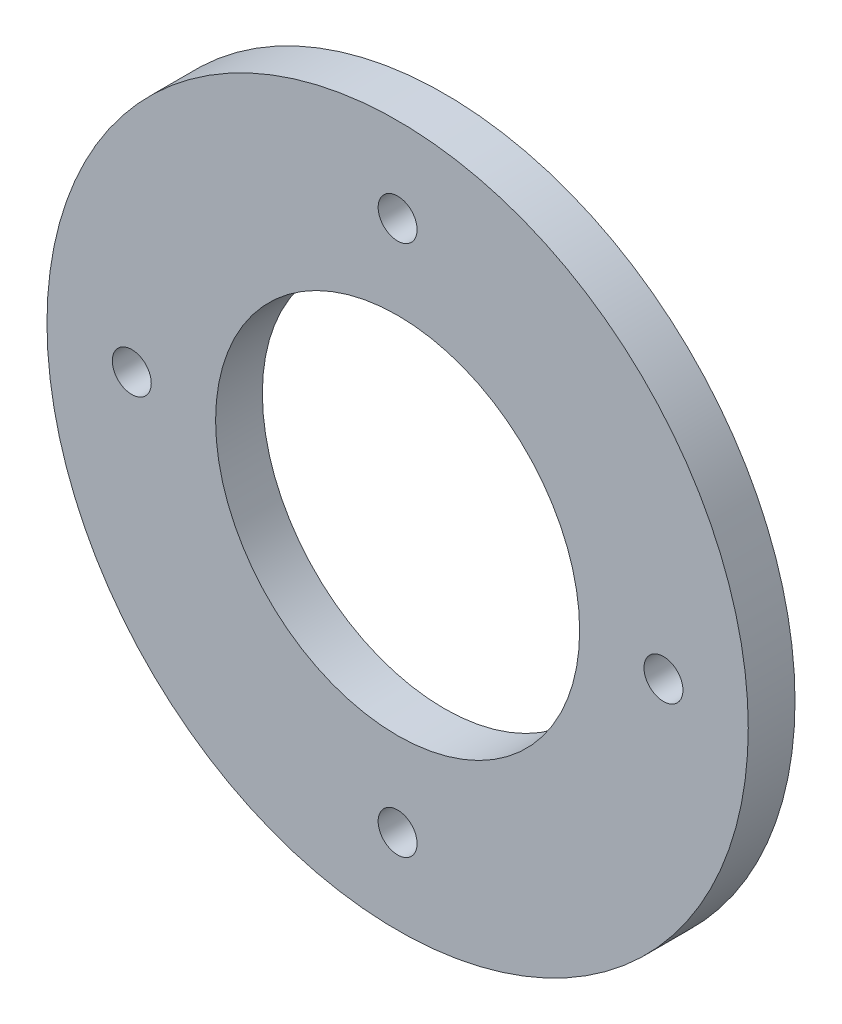
ISO-10303-21;
HEADER;
FILE_DESCRIPTION(('STEP AP214'),'2;1');
FILE_NAME('part.step','',(''),(''),'','','');
FILE_SCHEMA(('AUTOMOTIVE_DESIGN { 1 0 10303 214 1 1 1 1 }'));
ENDSEC;
DATA;
#1=APPLICATION_CONTEXT('core data for automotive mechanical design processes');
#2=APPLICATION_PROTOCOL_DEFINITION('international standard','automotive_design',2000,#1);
#3=PRODUCT_CONTEXT('',#1,'mechanical');
#4=PRODUCT('Part','Part','',(#3));
#5=PRODUCT_RELATED_PRODUCT_CATEGORY('part','',(#4));
#6=PRODUCT_DEFINITION_FORMATION('','',#4);
#7=PRODUCT_DEFINITION_CONTEXT('part definition',#1,'design');
#8=PRODUCT_DEFINITION('design','',#6,#7);
#9=PRODUCT_DEFINITION_SHAPE('','',#8);
#10=(LENGTH_UNIT() NAMED_UNIT(*) SI_UNIT(.MILLI.,.METRE.));
#11=(NAMED_UNIT(*) PLANE_ANGLE_UNIT() SI_UNIT($,.RADIAN.));
#12=(NAMED_UNIT(*) SI_UNIT($,.STERADIAN.) SOLID_ANGLE_UNIT());
#13=UNCERTAINTY_MEASURE_WITH_UNIT(LENGTH_MEASURE(1.E-05),#10,'distance_accuracy_value','');
#14=(GEOMETRIC_REPRESENTATION_CONTEXT(3) GLOBAL_UNCERTAINTY_ASSIGNED_CONTEXT((#13)) GLOBAL_UNIT_ASSIGNED_CONTEXT((#10,
#11,#12)) REPRESENTATION_CONTEXT('',''));
#15=CARTESIAN_POINT('',(0.,0.,0.));
#16=DIRECTION('',(0.,0.,1.));
#17=DIRECTION('',(1.,0.,0.));
#18=AXIS2_PLACEMENT_3D('',#15,#16,#17);
#19=CARTESIAN_POINT('',(0.,0.,3.));
#20=DIRECTION('',(0.,0.,1.));
#21=DIRECTION('',(1.,0.,0.));
#22=AXIS2_PLACEMENT_3D('',#19,#20,#21);
#23=PLANE('',#22);
#24=CARTESIAN_POINT('',(17.0577730501394,0.,3.));
#25=DIRECTION('',(0.,0.,1.));
#26=DIRECTION('',(1.,0.,0.));
#27=AXIS2_PLACEMENT_3D('',#24,#25,#26);
#28=CIRCLE('',#27,1.25);
#29=CARTESIAN_POINT('',(18.3077730501394,0.,3.));
#30=VERTEX_POINT('',#29);
#31=EDGE_CURVE('E78',#30,#30,#28,.T.);
#32=ORIENTED_EDGE('',*,*,#31,.F.);
#33=EDGE_LOOP('',(#32));
#34=FACE_BOUND('',#33,.T.);
#35=CARTESIAN_POINT('',(-17.0577730501394,0.,3.));
#36=DIRECTION('',(0.,0.,1.));
#37=DIRECTION('',(1.,0.,0.));
#38=AXIS2_PLACEMENT_3D('',#35,#36,#37);
#39=CIRCLE('',#38,1.25);
#40=CARTESIAN_POINT('',(-15.8077730501394,0.,3.));
#41=VERTEX_POINT('',#40);
#42=EDGE_CURVE('E62',#41,#41,#39,.T.);
#43=ORIENTED_EDGE('',*,*,#42,.F.);
#44=EDGE_LOOP('',(#43));
#45=FACE_BOUND('',#44,.T.);
#46=CARTESIAN_POINT('',(0.,0.,3.));
#47=DIRECTION('',(0.,0.,1.));
#48=DIRECTION('',(1.,0.,0.));
#49=AXIS2_PLACEMENT_3D('',#46,#47,#48);
#50=CIRCLE('',#49,22.5);
#51=CARTESIAN_POINT('',(22.5,0.,3.));
#52=VERTEX_POINT('',#51);
#53=EDGE_CURVE('E10',#52,#52,#50,.T.);
#54=ORIENTED_EDGE('',*,*,#53,.T.);
#55=EDGE_LOOP('',(#54));
#56=FACE_BOUND('',#55,.T.);
#57=CARTESIAN_POINT('',(0.,0.,3.));
#58=DIRECTION('',(0.,0.,1.));
#59=DIRECTION('',(1.,0.,0.));
#60=AXIS2_PLACEMENT_3D('',#57,#58,#59);
#61=CIRCLE('',#60,11.68);
#62=CARTESIAN_POINT('',(11.68,0.,3.));
#63=VERTEX_POINT('',#62);
#64=EDGE_CURVE('E56',#63,#63,#61,.T.);
#65=ORIENTED_EDGE('',*,*,#64,.F.);
#66=EDGE_LOOP('',(#65));
#67=FACE_BOUND('',#66,.T.);
#68=CARTESIAN_POINT('',(0.,17.0577730501394,3.));
#69=DIRECTION('',(0.,0.,1.));
#70=DIRECTION('',(1.,0.,0.));
#71=AXIS2_PLACEMENT_3D('',#68,#69,#70);
#72=CIRCLE('',#71,1.25);
#73=CARTESIAN_POINT('',(1.25,17.0577730501394,3.));
#74=VERTEX_POINT('',#73);
#75=EDGE_CURVE('E70',#74,#74,#72,.T.);
#76=ORIENTED_EDGE('',*,*,#75,.F.);
#77=EDGE_LOOP('',(#76));
#78=FACE_BOUND('',#77,.T.);
#79=CARTESIAN_POINT('',(0.,-17.0577730501394,3.));
#80=DIRECTION('',(0.,0.,1.));
#81=DIRECTION('',(1.,0.,0.));
#82=AXIS2_PLACEMENT_3D('',#79,#80,#81);
#83=CIRCLE('',#82,1.25);
#84=CARTESIAN_POINT('',(1.25,-17.0577730501394,3.));
#85=VERTEX_POINT('',#84);
#86=EDGE_CURVE('E86',#85,#85,#83,.T.);
#87=ORIENTED_EDGE('',*,*,#86,.F.);
#88=EDGE_LOOP('',(#87));
#89=FACE_BOUND('',#88,.T.);
#90=ADVANCED_FACE('F43',(#34,#45,#56,#67,#78,#89),#23,.T.);
#91=CARTESIAN_POINT('',(0.,0.,0.));
#92=DIRECTION('',(0.,0.,1.));
#93=DIRECTION('',(1.,0.,0.));
#94=AXIS2_PLACEMENT_3D('',#91,#92,#93);
#95=PLANE('',#94);
#96=CARTESIAN_POINT('',(0.,0.,0.));
#97=DIRECTION('',(0.,0.,1.));
#98=DIRECTION('',(1.,0.,0.));
#99=AXIS2_PLACEMENT_3D('',#96,#97,#98);
#100=CIRCLE('',#99,22.5);
#101=CARTESIAN_POINT('',(22.5,0.,0.));
#102=VERTEX_POINT('',#101);
#103=EDGE_CURVE('E47',#102,#102,#100,.T.);
#104=ORIENTED_EDGE('',*,*,#103,.F.);
#105=EDGE_LOOP('',(#104));
#106=FACE_BOUND('',#105,.T.);
#107=CARTESIAN_POINT('',(0.,0.,0.));
#108=DIRECTION('',(0.,0.,1.));
#109=DIRECTION('',(1.,0.,0.));
#110=AXIS2_PLACEMENT_3D('',#107,#108,#109);
#111=CIRCLE('',#110,11.68);
#112=CARTESIAN_POINT('',(11.68,0.,0.));
#113=VERTEX_POINT('',#112);
#114=EDGE_CURVE('E58',#113,#113,#111,.T.);
#115=ORIENTED_EDGE('',*,*,#114,.T.);
#116=EDGE_LOOP('',(#115));
#117=FACE_BOUND('',#116,.T.);
#118=CARTESIAN_POINT('',(-17.0577730501394,0.,0.));
#119=DIRECTION('',(0.,0.,1.));
#120=DIRECTION('',(1.,0.,0.));
#121=AXIS2_PLACEMENT_3D('',#118,#119,#120);
#122=CIRCLE('',#121,1.25);
#123=CARTESIAN_POINT('',(-15.8077730501394,0.,0.));
#124=VERTEX_POINT('',#123);
#125=EDGE_CURVE('E66',#124,#124,#122,.T.);
#126=ORIENTED_EDGE('',*,*,#125,.T.);
#127=EDGE_LOOP('',(#126));
#128=FACE_BOUND('',#127,.T.);
#129=CARTESIAN_POINT('',(0.,17.0577730501394,0.));
#130=DIRECTION('',(0.,0.,1.));
#131=DIRECTION('',(1.,0.,0.));
#132=AXIS2_PLACEMENT_3D('',#129,#130,#131);
#133=CIRCLE('',#132,1.25);
#134=CARTESIAN_POINT('',(1.25,17.0577730501394,0.));
#135=VERTEX_POINT('',#134);
#136=EDGE_CURVE('E74',#135,#135,#133,.T.);
#137=ORIENTED_EDGE('',*,*,#136,.T.);
#138=EDGE_LOOP('',(#137));
#139=FACE_BOUND('',#138,.T.);
#140=CARTESIAN_POINT('',(17.0577730501394,0.,0.));
#141=DIRECTION('',(0.,0.,1.));
#142=DIRECTION('',(1.,0.,0.));
#143=AXIS2_PLACEMENT_3D('',#140,#141,#142);
#144=CIRCLE('',#143,1.25);
#145=CARTESIAN_POINT('',(18.3077730501394,0.,0.));
#146=VERTEX_POINT('',#145);
#147=EDGE_CURVE('E82',#146,#146,#144,.T.);
#148=ORIENTED_EDGE('',*,*,#147,.T.);
#149=EDGE_LOOP('',(#148));
#150=FACE_BOUND('',#149,.T.);
#151=CARTESIAN_POINT('',(0.,-17.0577730501394,0.));
#152=DIRECTION('',(0.,0.,1.));
#153=DIRECTION('',(1.,0.,0.));
#154=AXIS2_PLACEMENT_3D('',#151,#152,#153);
#155=CIRCLE('',#154,1.25);
#156=CARTESIAN_POINT('',(1.25,-17.0577730501394,0.));
#157=VERTEX_POINT('',#156);
#158=EDGE_CURVE('E90',#157,#157,#155,.T.);
#159=ORIENTED_EDGE('',*,*,#158,.T.);
#160=EDGE_LOOP('',(#159));
#161=FACE_BOUND('',#160,.T.);
#162=ADVANCED_FACE('F102',(#106,#117,#128,#139,#150,#161),#95,.F.);
#163=CARTESIAN_POINT('',(0.,0.,3.));
#164=DIRECTION('',(0.,0.,-1.));
#165=DIRECTION('',(-1.,0.,0.));
#166=AXIS2_PLACEMENT_3D('',#163,#164,#165);
#167=CYLINDRICAL_SURFACE('',#166,22.5);
#168=ORIENTED_EDGE('',*,*,#53,.F.);
#169=EDGE_LOOP('',(#168));
#170=FACE_BOUND('',#169,.T.);
#171=ORIENTED_EDGE('',*,*,#103,.T.);
#172=EDGE_LOOP('',(#171));
#173=FACE_BOUND('',#172,.T.);
#174=ADVANCED_FACE('F45',(#170,#173),#167,.T.);
#175=CARTESIAN_POINT('',(0.,0.,3.));
#176=DIRECTION('',(0.,0.,-1.));
#177=DIRECTION('',(-1.,0.,0.));
#178=AXIS2_PLACEMENT_3D('',#175,#176,#177);
#179=CYLINDRICAL_SURFACE('',#178,11.68);
#180=ORIENTED_EDGE('',*,*,#64,.T.);
#181=EDGE_LOOP('',(#180));
#182=FACE_BOUND('',#181,.T.);
#183=ORIENTED_EDGE('',*,*,#114,.F.);
#184=EDGE_LOOP('',(#183));
#185=FACE_BOUND('',#184,.T.);
#186=ADVANCED_FACE('F112',(#182,#185),#179,.F.);
#187=CARTESIAN_POINT('',(-17.0577730501394,0.,3.));
#188=DIRECTION('',(0.,0.,-1.));
#189=DIRECTION('',(-1.,0.,0.));
#190=AXIS2_PLACEMENT_3D('',#187,#188,#189);
#191=CYLINDRICAL_SURFACE('',#190,1.25);
#192=ORIENTED_EDGE('',*,*,#42,.T.);
#193=EDGE_LOOP('',(#192));
#194=FACE_BOUND('',#193,.T.);
#195=ORIENTED_EDGE('',*,*,#125,.F.);
#196=EDGE_LOOP('',(#195));
#197=FACE_BOUND('',#196,.T.);
#198=ADVANCED_FACE('F115',(#194,#197),#191,.F.);
#199=CARTESIAN_POINT('',(0.,17.0577730501394,3.));
#200=DIRECTION('',(0.,0.,-1.));
#201=DIRECTION('',(-1.,0.,0.));
#202=AXIS2_PLACEMENT_3D('',#199,#200,#201);
#203=CYLINDRICAL_SURFACE('',#202,1.25);
#204=ORIENTED_EDGE('',*,*,#75,.T.);
#205=EDGE_LOOP('',(#204));
#206=FACE_BOUND('',#205,.T.);
#207=ORIENTED_EDGE('',*,*,#136,.F.);
#208=EDGE_LOOP('',(#207));
#209=FACE_BOUND('',#208,.T.);
#210=ADVANCED_FACE('F119',(#206,#209),#203,.F.);
#211=CARTESIAN_POINT('',(17.0577730501394,0.,3.));
#212=DIRECTION('',(0.,0.,-1.));
#213=DIRECTION('',(-1.,0.,0.));
#214=AXIS2_PLACEMENT_3D('',#211,#212,#213);
#215=CYLINDRICAL_SURFACE('',#214,1.25);
#216=ORIENTED_EDGE('',*,*,#31,.T.);
#217=EDGE_LOOP('',(#216));
#218=FACE_BOUND('',#217,.T.);
#219=ORIENTED_EDGE('',*,*,#147,.F.);
#220=EDGE_LOOP('',(#219));
#221=FACE_BOUND('',#220,.T.);
#222=ADVANCED_FACE('F123',(#218,#221),#215,.F.);
#223=CARTESIAN_POINT('',(0.,-17.0577730501394,3.));
#224=DIRECTION('',(0.,0.,-1.));
#225=DIRECTION('',(-1.,0.,0.));
#226=AXIS2_PLACEMENT_3D('',#223,#224,#225);
#227=CYLINDRICAL_SURFACE('',#226,1.25);
#228=ORIENTED_EDGE('',*,*,#86,.T.);
#229=EDGE_LOOP('',(#228));
#230=FACE_BOUND('',#229,.T.);
#231=ORIENTED_EDGE('',*,*,#158,.F.);
#232=EDGE_LOOP('',(#231));
#233=FACE_BOUND('',#232,.T.);
#234=ADVANCED_FACE('F98',(#230,#233),#227,.F.);
#235=CLOSED_SHELL('',(#90,#162,#174,#186,#198,#210,#222,#234));
#236=MANIFOLD_SOLID_BREP('B2',#235);
#237=ADVANCED_BREP_SHAPE_REPRESENTATION('',(#18,#236),#14);
#238=SHAPE_DEFINITION_REPRESENTATION(#9,#237);
ENDSEC;
END-ISO-10303-21;
